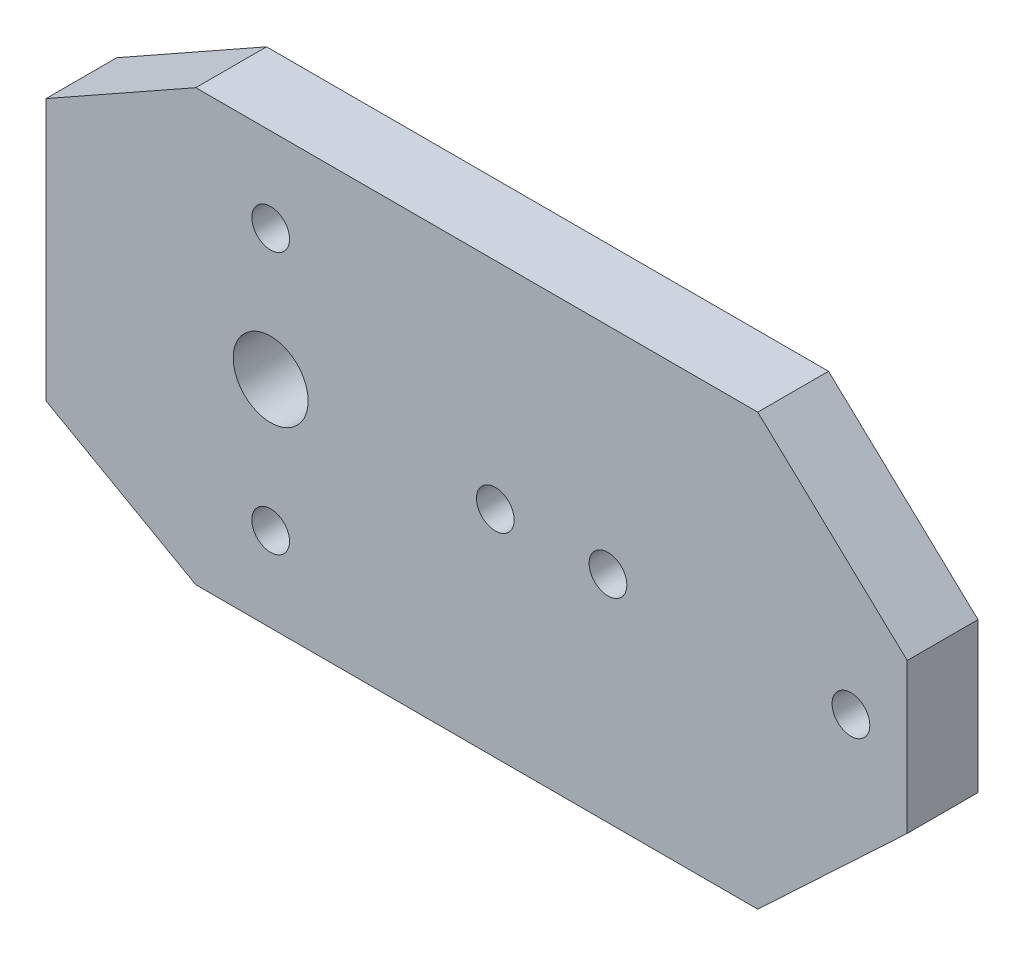
ISO-10303-21;
HEADER;
FILE_DESCRIPTION(('STEP AP214'),'2;1');
FILE_NAME('part.step','',(''),(''),'','','');
FILE_SCHEMA(('AUTOMOTIVE_DESIGN { 1 0 10303 214 1 1 1 1 }'));
ENDSEC;
DATA;
#1=APPLICATION_CONTEXT('core data for automotive mechanical design processes');
#2=APPLICATION_PROTOCOL_DEFINITION('international standard','automotive_design',2000,#1);
#3=PRODUCT_CONTEXT('',#1,'mechanical');
#4=PRODUCT('Part','Part','',(#3));
#5=PRODUCT_RELATED_PRODUCT_CATEGORY('part','',(#4));
#6=PRODUCT_DEFINITION_FORMATION('','',#4);
#7=PRODUCT_DEFINITION_CONTEXT('part definition',#1,'design');
#8=PRODUCT_DEFINITION('design','',#6,#7);
#9=PRODUCT_DEFINITION_SHAPE('','',#8);
#10=(LENGTH_UNIT() NAMED_UNIT(*) SI_UNIT(.MILLI.,.METRE.));
#11=(NAMED_UNIT(*) PLANE_ANGLE_UNIT() SI_UNIT($,.RADIAN.));
#12=(NAMED_UNIT(*) SI_UNIT($,.STERADIAN.) SOLID_ANGLE_UNIT());
#13=UNCERTAINTY_MEASURE_WITH_UNIT(LENGTH_MEASURE(1.E-05),#10,'distance_accuracy_value','');
#14=(GEOMETRIC_REPRESENTATION_CONTEXT(3) GLOBAL_UNCERTAINTY_ASSIGNED_CONTEXT((#13)) GLOBAL_UNIT_ASSIGNED_CONTEXT((#10,
#11,#12)) REPRESENTATION_CONTEXT('',''));
#15=CARTESIAN_POINT('',(0.,0.,0.));
#16=DIRECTION('',(0.,0.,1.));
#17=DIRECTION('',(1.,0.,0.));
#18=AXIS2_PLACEMENT_3D('',#15,#16,#17);
#19=CARTESIAN_POINT('',(0.,0.,6.));
#20=DIRECTION('',(0.,0.,1.));
#21=DIRECTION('',(1.,0.,0.));
#22=AXIS2_PLACEMENT_3D('',#19,#20,#21);
#23=PLANE('',#22);
#24=CARTESIAN_POINT('',(0.,11.1,6.));
#25=DIRECTION('',(0.,0.,1.));
#26=DIRECTION('',(1.,0.,0.));
#27=AXIS2_PLACEMENT_3D('',#24,#25,#26);
#28=CIRCLE('',#27,1.6);
#29=CARTESIAN_POINT('',(1.6,11.1,6.));
#30=VERTEX_POINT('',#29);
#31=EDGE_CURVE('E206',#30,#30,#28,.T.);
#32=ORIENTED_EDGE('',*,*,#31,.F.);
#33=EDGE_LOOP('',(#32));
#34=FACE_BOUND('',#33,.T.);
#35=CARTESIAN_POINT('',(49.2,0.,6.));
#36=DIRECTION('',(0.,0.,1.));
#37=DIRECTION('',(1.,0.,0.));
#38=AXIS2_PLACEMENT_3D('',#35,#36,#37);
#39=CIRCLE('',#38,1.6);
#40=CARTESIAN_POINT('',(50.8,0.,6.));
#41=VERTEX_POINT('',#40);
#42=EDGE_CURVE('E193',#41,#41,#39,.T.);
#43=ORIENTED_EDGE('',*,*,#42,.F.);
#44=EDGE_LOOP('',(#43));
#45=FACE_BOUND('',#44,.T.);
#46=CARTESIAN_POINT('',(19.05,0.,6.));
#47=DIRECTION('',(0.,0.,1.));
#48=DIRECTION('',(1.,0.,0.));
#49=AXIS2_PLACEMENT_3D('',#46,#47,#48);
#50=CIRCLE('',#49,1.6);
#51=CARTESIAN_POINT('',(20.65,0.,6.));
#52=VERTEX_POINT('',#51);
#53=EDGE_CURVE('E139',#52,#52,#50,.T.);
#54=ORIENTED_EDGE('',*,*,#53,.F.);
#55=EDGE_LOOP('',(#54));
#56=FACE_BOUND('',#55,.T.);
#57=DIRECTION('',(0.,-1.,0.));
#58=VECTOR('',#57,1.);
#59=CARTESIAN_POINT('',(-19.05,11.1,6.));
#60=LINE('',#59,#58);
#61=CARTESIAN_POINT('',(-19.05,11.1,6.));
#62=VERTEX_POINT('',#61);
#63=CARTESIAN_POINT('',(-19.05,-11.1,6.));
#64=VERTEX_POINT('',#63);
#65=EDGE_CURVE('E151',#62,#64,#60,.T.);
#66=ORIENTED_EDGE('',*,*,#65,.T.);
#67=DIRECTION('',(0.87139223527957,-0.490586967106215,0.));
#68=VECTOR('',#67,1.);
#69=CARTESIAN_POINT('',(-19.05,-11.1,6.));
#70=LINE('',#69,#68);
#71=CARTESIAN_POINT('',(-6.35,-18.25,6.));
#72=VERTEX_POINT('',#71);
#73=EDGE_CURVE('E97',#64,#72,#70,.T.);
#74=ORIENTED_EDGE('',*,*,#73,.T.);
#75=DIRECTION('',(1.,0.,0.));
#76=VECTOR('',#75,1.);
#77=CARTESIAN_POINT('',(-6.35,-18.25,6.));
#78=LINE('',#77,#76);
#79=CARTESIAN_POINT('',(41.3,-18.25,6.));
#80=VERTEX_POINT('',#79);
#81=EDGE_CURVE('E167',#72,#80,#78,.T.);
#82=ORIENTED_EDGE('',*,*,#81,.T.);
#83=DIRECTION('',(0.729043744639039,0.684467105420478,0.));
#84=VECTOR('',#83,1.);
#85=CARTESIAN_POINT('',(41.3,-18.25,6.));
#86=LINE('',#85,#84);
#87=CARTESIAN_POINT('',(53.975,-6.35,6.));
#88=VERTEX_POINT('',#87);
#89=EDGE_CURVE('E178',#80,#88,#86,.T.);
#90=ORIENTED_EDGE('',*,*,#89,.T.);
#91=DIRECTION('',(0.,1.,0.));
#92=VECTOR('',#91,1.);
#93=CARTESIAN_POINT('',(53.975,-6.35,6.));
#94=LINE('',#93,#92);
#95=CARTESIAN_POINT('',(53.975,6.35,6.));
#96=VERTEX_POINT('',#95);
#97=EDGE_CURVE('E119',#88,#96,#94,.T.);
#98=ORIENTED_EDGE('',*,*,#97,.T.);
#99=DIRECTION('',(-0.729043744639039,0.684467105420478,0.));
#100=VECTOR('',#99,1.);
#101=CARTESIAN_POINT('',(53.975,6.35,6.));
#102=LINE('',#101,#100);
#103=CARTESIAN_POINT('',(41.3,18.25,6.));
#104=VERTEX_POINT('',#103);
#105=EDGE_CURVE('E115',#96,#104,#102,.T.);
#106=ORIENTED_EDGE('',*,*,#105,.T.);
#107=DIRECTION('',(-1.,0.,0.));
#108=VECTOR('',#107,1.);
#109=CARTESIAN_POINT('',(41.3,18.25,6.));
#110=LINE('',#109,#108);
#111=CARTESIAN_POINT('',(-6.35,18.25,6.));
#112=VERTEX_POINT('',#111);
#113=EDGE_CURVE('E117',#104,#112,#110,.T.);
#114=ORIENTED_EDGE('',*,*,#113,.T.);
#115=DIRECTION('',(-0.87139223527957,-0.490586967106215,0.));
#116=VECTOR('',#115,1.);
#117=CARTESIAN_POINT('',(-6.35,18.25,6.));
#118=LINE('',#117,#116);
#119=EDGE_CURVE('E57',#112,#62,#118,.T.);
#120=ORIENTED_EDGE('',*,*,#119,.T.);
#121=EDGE_LOOP('',(#66,#74,#82,#90,#98,#106,#114,#120));
#122=FACE_BOUND('',#121,.T.);
#123=CARTESIAN_POINT('',(28.6,0.,6.));
#124=DIRECTION('',(0.,0.,1.));
#125=DIRECTION('',(1.,0.,0.));
#126=AXIS2_PLACEMENT_3D('',#123,#124,#125);
#127=CIRCLE('',#126,1.6);
#128=CARTESIAN_POINT('',(30.2,0.,6.));
#129=VERTEX_POINT('',#128);
#130=EDGE_CURVE('E189',#129,#129,#127,.T.);
#131=ORIENTED_EDGE('',*,*,#130,.F.);
#132=EDGE_LOOP('',(#131));
#133=FACE_BOUND('',#132,.T.);
#134=CARTESIAN_POINT('',(0.,0.,6.));
#135=DIRECTION('',(0.,0.,1.));
#136=DIRECTION('',(1.,0.,0.));
#137=AXIS2_PLACEMENT_3D('',#134,#135,#136);
#138=CIRCLE('',#137,3.175);
#139=CARTESIAN_POINT('',(3.175,0.,6.));
#140=VERTEX_POINT('',#139);
#141=EDGE_CURVE('E199',#140,#140,#138,.T.);
#142=ORIENTED_EDGE('',*,*,#141,.F.);
#143=EDGE_LOOP('',(#142));
#144=FACE_BOUND('',#143,.T.);
#145=CARTESIAN_POINT('',(0.,-11.1,6.));
#146=DIRECTION('',(0.,0.,1.));
#147=DIRECTION('',(1.,0.,0.));
#148=AXIS2_PLACEMENT_3D('',#145,#146,#147);
#149=CIRCLE('',#148,1.6);
#150=CARTESIAN_POINT('',(1.6,-11.1,6.));
#151=VERTEX_POINT('',#150);
#152=EDGE_CURVE('E215',#151,#151,#149,.T.);
#153=ORIENTED_EDGE('',*,*,#152,.F.);
#154=EDGE_LOOP('',(#153));
#155=FACE_BOUND('',#154,.T.);
#156=ADVANCED_FACE('F39',(#34,#45,#56,#122,#133,#144,#155),#23,.T.);
#157=CARTESIAN_POINT('',(0.,0.,0.));
#158=DIRECTION('',(0.,0.,1.));
#159=DIRECTION('',(1.,0.,0.));
#160=AXIS2_PLACEMENT_3D('',#157,#158,#159);
#161=PLANE('',#160);
#162=DIRECTION('',(0.,-1.,0.));
#163=VECTOR('',#162,1.);
#164=CARTESIAN_POINT('',(-19.05,11.1,0.));
#165=LINE('',#164,#163);
#166=CARTESIAN_POINT('',(-19.05,11.1,0.));
#167=VERTEX_POINT('',#166);
#168=CARTESIAN_POINT('',(-19.05,-11.1,0.));
#169=VERTEX_POINT('',#168);
#170=EDGE_CURVE('E136',#167,#169,#165,.T.);
#171=ORIENTED_EDGE('',*,*,#170,.F.);
#172=DIRECTION('',(-0.87139223527957,-0.490586967106215,0.));
#173=VECTOR('',#172,1.);
#174=CARTESIAN_POINT('',(-6.35,18.25,0.));
#175=LINE('',#174,#173);
#176=CARTESIAN_POINT('',(-6.35,18.25,0.));
#177=VERTEX_POINT('',#176);
#178=EDGE_CURVE('E93',#177,#167,#175,.T.);
#179=ORIENTED_EDGE('',*,*,#178,.F.);
#180=DIRECTION('',(-1.,0.,0.));
#181=VECTOR('',#180,1.);
#182=CARTESIAN_POINT('',(41.3,18.25,0.));
#183=LINE('',#182,#181);
#184=CARTESIAN_POINT('',(41.3,18.25,0.));
#185=VERTEX_POINT('',#184);
#186=EDGE_CURVE('E84',#185,#177,#183,.T.);
#187=ORIENTED_EDGE('',*,*,#186,.F.);
#188=DIRECTION('',(-0.729043744639039,0.684467105420478,0.));
#189=VECTOR('',#188,1.);
#190=CARTESIAN_POINT('',(53.975,6.35,0.));
#191=LINE('',#190,#189);
#192=CARTESIAN_POINT('',(53.975,6.35,0.));
#193=VERTEX_POINT('',#192);
#194=EDGE_CURVE('E127',#193,#185,#191,.T.);
#195=ORIENTED_EDGE('',*,*,#194,.F.);
#196=DIRECTION('',(0.,1.,0.));
#197=VECTOR('',#196,1.);
#198=CARTESIAN_POINT('',(53.975,-6.35,0.));
#199=LINE('',#198,#197);
#200=CARTESIAN_POINT('',(53.975,-6.35,0.));
#201=VERTEX_POINT('',#200);
#202=EDGE_CURVE('E148',#201,#193,#199,.T.);
#203=ORIENTED_EDGE('',*,*,#202,.F.);
#204=DIRECTION('',(0.729043744639039,0.684467105420478,0.));
#205=VECTOR('',#204,1.);
#206=CARTESIAN_POINT('',(41.3,-18.25,0.));
#207=LINE('',#206,#205);
#208=CARTESIAN_POINT('',(41.3,-18.25,0.));
#209=VERTEX_POINT('',#208);
#210=EDGE_CURVE('E145',#209,#201,#207,.T.);
#211=ORIENTED_EDGE('',*,*,#210,.F.);
#212=DIRECTION('',(1.,0.,0.));
#213=VECTOR('',#212,1.);
#214=CARTESIAN_POINT('',(-6.35,-18.25,0.));
#215=LINE('',#214,#213);
#216=CARTESIAN_POINT('',(-6.35,-18.25,0.));
#217=VERTEX_POINT('',#216);
#218=EDGE_CURVE('E142',#217,#209,#215,.T.);
#219=ORIENTED_EDGE('',*,*,#218,.F.);
#220=DIRECTION('',(0.87139223527957,-0.490586967106215,0.));
#221=VECTOR('',#220,1.);
#222=CARTESIAN_POINT('',(-19.05,-11.1,0.));
#223=LINE('',#222,#221);
#224=EDGE_CURVE('E138',#169,#217,#223,.T.);
#225=ORIENTED_EDGE('',*,*,#224,.F.);
#226=EDGE_LOOP('',(#171,#179,#187,#195,#203,#211,#219,#225));
#227=FACE_BOUND('',#226,.T.);
#228=CARTESIAN_POINT('',(19.05,0.,0.));
#229=DIRECTION('',(0.,0.,1.));
#230=DIRECTION('',(1.,0.,0.));
#231=AXIS2_PLACEMENT_3D('',#228,#229,#230);
#232=CIRCLE('',#231,1.6);
#233=CARTESIAN_POINT('',(20.65,0.,0.));
#234=VERTEX_POINT('',#233);
#235=EDGE_CURVE('E183',#234,#234,#232,.T.);
#236=ORIENTED_EDGE('',*,*,#235,.T.);
#237=EDGE_LOOP('',(#236));
#238=FACE_BOUND('',#237,.T.);
#239=CARTESIAN_POINT('',(28.6,0.,0.));
#240=DIRECTION('',(0.,0.,1.));
#241=DIRECTION('',(1.,0.,0.));
#242=AXIS2_PLACEMENT_3D('',#239,#240,#241);
#243=CIRCLE('',#242,1.6);
#244=CARTESIAN_POINT('',(30.2,0.,0.));
#245=VERTEX_POINT('',#244);
#246=EDGE_CURVE('E191',#245,#245,#243,.T.);
#247=ORIENTED_EDGE('',*,*,#246,.T.);
#248=EDGE_LOOP('',(#247));
#249=FACE_BOUND('',#248,.T.);
#250=CARTESIAN_POINT('',(49.2,0.,0.));
#251=DIRECTION('',(0.,0.,1.));
#252=DIRECTION('',(1.,0.,0.));
#253=AXIS2_PLACEMENT_3D('',#250,#251,#252);
#254=CIRCLE('',#253,1.6);
#255=CARTESIAN_POINT('',(50.8,0.,0.));
#256=VERTEX_POINT('',#255);
#257=EDGE_CURVE('E197',#256,#256,#254,.T.);
#258=ORIENTED_EDGE('',*,*,#257,.T.);
#259=EDGE_LOOP('',(#258));
#260=FACE_BOUND('',#259,.T.);
#261=CARTESIAN_POINT('',(0.,0.,0.));
#262=DIRECTION('',(0.,0.,1.));
#263=DIRECTION('',(1.,0.,0.));
#264=AXIS2_PLACEMENT_3D('',#261,#262,#263);
#265=CIRCLE('',#264,3.175);
#266=CARTESIAN_POINT('',(3.175,0.,0.));
#267=VERTEX_POINT('',#266);
#268=EDGE_CURVE('E201',#267,#267,#265,.T.);
#269=ORIENTED_EDGE('',*,*,#268,.T.);
#270=EDGE_LOOP('',(#269));
#271=FACE_BOUND('',#270,.T.);
#272=CARTESIAN_POINT('',(0.,11.1,0.));
#273=DIRECTION('',(0.,0.,1.));
#274=DIRECTION('',(1.,0.,0.));
#275=AXIS2_PLACEMENT_3D('',#272,#273,#274);
#276=CIRCLE('',#275,1.6);
#277=CARTESIAN_POINT('',(1.6,11.1,0.));
#278=VERTEX_POINT('',#277);
#279=EDGE_CURVE('E207',#278,#278,#276,.T.);
#280=ORIENTED_EDGE('',*,*,#279,.T.);
#281=EDGE_LOOP('',(#280));
#282=FACE_BOUND('',#281,.T.);
#283=CARTESIAN_POINT('',(0.,-11.1,0.));
#284=DIRECTION('',(0.,0.,1.));
#285=DIRECTION('',(1.,0.,0.));
#286=AXIS2_PLACEMENT_3D('',#283,#284,#285);
#287=CIRCLE('',#286,1.6);
#288=CARTESIAN_POINT('',(1.6,-11.1,0.));
#289=VERTEX_POINT('',#288);
#290=EDGE_CURVE('E214',#289,#289,#287,.T.);
#291=ORIENTED_EDGE('',*,*,#290,.T.);
#292=EDGE_LOOP('',(#291));
#293=FACE_BOUND('',#292,.T.);
#294=ADVANCED_FACE('F168',(#227,#238,#249,#260,#271,#282,#293),#161,.F.);
#295=CARTESIAN_POINT('',(-19.05,11.1,6.));
#296=DIRECTION('',(1.,0.,0.));
#297=DIRECTION('',(0.,0.,-1.));
#298=AXIS2_PLACEMENT_3D('',#295,#296,#297);
#299=PLANE('',#298);
#300=ORIENTED_EDGE('',*,*,#170,.T.);
#301=DIRECTION('',(0.,0.,-1.));
#302=VECTOR('',#301,1.);
#303=CARTESIAN_POINT('',(-19.05,-11.1,6.));
#304=LINE('',#303,#302);
#305=EDGE_CURVE('E11',#64,#169,#304,.T.);
#306=ORIENTED_EDGE('',*,*,#305,.F.);
#307=ORIENTED_EDGE('',*,*,#65,.F.);
#308=DIRECTION('',(0.,0.,-1.));
#309=VECTOR('',#308,1.);
#310=CARTESIAN_POINT('',(-19.05,11.1,6.));
#311=LINE('',#310,#309);
#312=EDGE_CURVE('E135',#62,#167,#311,.T.);
#313=ORIENTED_EDGE('',*,*,#312,.T.);
#314=EDGE_LOOP('',(#300,#306,#307,#313));
#315=FACE_BOUND('',#314,.T.);
#316=ADVANCED_FACE('F41',(#315),#299,.F.);
#317=CARTESIAN_POINT('',(-19.05,-11.1,6.));
#318=DIRECTION('',(0.490586967106215,0.87139223527957,0.));
#319=DIRECTION('',(-0.87139223527957,0.490586967106215,0.));
#320=AXIS2_PLACEMENT_3D('',#317,#318,#319);
#321=PLANE('',#320);
#322=ORIENTED_EDGE('',*,*,#224,.T.);
#323=DIRECTION('',(0.,0.,-1.));
#324=VECTOR('',#323,1.);
#325=CARTESIAN_POINT('',(-6.35,-18.25,6.));
#326=LINE('',#325,#324);
#327=EDGE_CURVE('E48',#72,#217,#326,.T.);
#328=ORIENTED_EDGE('',*,*,#327,.F.);
#329=ORIENTED_EDGE('',*,*,#73,.F.);
#330=ORIENTED_EDGE('',*,*,#305,.T.);
#331=EDGE_LOOP('',(#322,#328,#329,#330));
#332=FACE_BOUND('',#331,.T.);
#333=ADVANCED_FACE('F248',(#332),#321,.F.);
#334=CARTESIAN_POINT('',(-6.35,-18.25,6.));
#335=DIRECTION('',(0.,1.,0.));
#336=DIRECTION('',(0.,0.,1.));
#337=AXIS2_PLACEMENT_3D('',#334,#335,#336);
#338=PLANE('',#337);
#339=ORIENTED_EDGE('',*,*,#218,.T.);
#340=DIRECTION('',(0.,0.,-1.));
#341=VECTOR('',#340,1.);
#342=CARTESIAN_POINT('',(41.3,-18.25,6.));
#343=LINE('',#342,#341);
#344=EDGE_CURVE('E158',#80,#209,#343,.T.);
#345=ORIENTED_EDGE('',*,*,#344,.F.);
#346=ORIENTED_EDGE('',*,*,#81,.F.);
#347=ORIENTED_EDGE('',*,*,#327,.T.);
#348=EDGE_LOOP('',(#339,#345,#346,#347));
#349=FACE_BOUND('',#348,.T.);
#350=ADVANCED_FACE('F163',(#349),#338,.F.);
#351=CARTESIAN_POINT('',(41.3,-18.25,6.));
#352=DIRECTION('',(-0.684467105420478,0.729043744639039,0.));
#353=DIRECTION('',(-0.729043744639039,-0.684467105420478,0.));
#354=AXIS2_PLACEMENT_3D('',#351,#352,#353);
#355=PLANE('',#354);
#356=ORIENTED_EDGE('',*,*,#210,.T.);
#357=DIRECTION('',(0.,0.,-1.));
#358=VECTOR('',#357,1.);
#359=CARTESIAN_POINT('',(53.975,-6.35,6.));
#360=LINE('',#359,#358);
#361=EDGE_CURVE('E154',#88,#201,#360,.T.);
#362=ORIENTED_EDGE('',*,*,#361,.F.);
#363=ORIENTED_EDGE('',*,*,#89,.F.);
#364=ORIENTED_EDGE('',*,*,#344,.T.);
#365=EDGE_LOOP('',(#356,#362,#363,#364));
#366=FACE_BOUND('',#365,.T.);
#367=ADVANCED_FACE('F173',(#366),#355,.F.);
#368=CARTESIAN_POINT('',(53.975,-6.35,6.));
#369=DIRECTION('',(-1.,0.,0.));
#370=DIRECTION('',(0.,0.,1.));
#371=AXIS2_PLACEMENT_3D('',#368,#369,#370);
#372=PLANE('',#371);
#373=ORIENTED_EDGE('',*,*,#202,.T.);
#374=DIRECTION('',(0.,0.,-1.));
#375=VECTOR('',#374,1.);
#376=CARTESIAN_POINT('',(53.975,6.35,6.));
#377=LINE('',#376,#375);
#378=EDGE_CURVE('E130',#96,#193,#377,.T.);
#379=ORIENTED_EDGE('',*,*,#378,.F.);
#380=ORIENTED_EDGE('',*,*,#97,.F.);
#381=ORIENTED_EDGE('',*,*,#361,.T.);
#382=EDGE_LOOP('',(#373,#379,#380,#381));
#383=FACE_BOUND('',#382,.T.);
#384=ADVANCED_FACE('F177',(#383),#372,.F.);
#385=CARTESIAN_POINT('',(53.975,6.35,6.));
#386=DIRECTION('',(-0.684467105420478,-0.729043744639039,0.));
#387=DIRECTION('',(0.729043744639039,-0.684467105420478,0.));
#388=AXIS2_PLACEMENT_3D('',#385,#386,#387);
#389=PLANE('',#388);
#390=ORIENTED_EDGE('',*,*,#194,.T.);
#391=DIRECTION('',(0.,0.,-1.));
#392=VECTOR('',#391,1.);
#393=CARTESIAN_POINT('',(41.3,18.25,6.));
#394=LINE('',#393,#392);
#395=EDGE_CURVE('E122',#104,#185,#394,.T.);
#396=ORIENTED_EDGE('',*,*,#395,.F.);
#397=ORIENTED_EDGE('',*,*,#105,.F.);
#398=ORIENTED_EDGE('',*,*,#378,.T.);
#399=EDGE_LOOP('',(#390,#396,#397,#398));
#400=FACE_BOUND('',#399,.T.);
#401=ADVANCED_FACE('F123',(#400),#389,.F.);
#402=CARTESIAN_POINT('',(41.3,18.25,6.));
#403=DIRECTION('',(0.,-1.,0.));
#404=DIRECTION('',(0.,0.,-1.));
#405=AXIS2_PLACEMENT_3D('',#402,#403,#404);
#406=PLANE('',#405);
#407=ORIENTED_EDGE('',*,*,#186,.T.);
#408=DIRECTION('',(0.,0.,-1.));
#409=VECTOR('',#408,1.);
#410=CARTESIAN_POINT('',(-6.35,18.25,6.));
#411=LINE('',#410,#409);
#412=EDGE_CURVE('E126',#112,#177,#411,.T.);
#413=ORIENTED_EDGE('',*,*,#412,.F.);
#414=ORIENTED_EDGE('',*,*,#113,.F.);
#415=ORIENTED_EDGE('',*,*,#395,.T.);
#416=EDGE_LOOP('',(#407,#413,#414,#415));
#417=FACE_BOUND('',#416,.T.);
#418=ADVANCED_FACE('F128',(#417),#406,.F.);
#419=CARTESIAN_POINT('',(-6.35,18.25,6.));
#420=DIRECTION('',(0.490586967106215,-0.87139223527957,0.));
#421=DIRECTION('',(0.87139223527957,0.490586967106215,0.));
#422=AXIS2_PLACEMENT_3D('',#419,#420,#421);
#423=PLANE('',#422);
#424=ORIENTED_EDGE('',*,*,#178,.T.);
#425=ORIENTED_EDGE('',*,*,#312,.F.);
#426=ORIENTED_EDGE('',*,*,#119,.F.);
#427=ORIENTED_EDGE('',*,*,#412,.T.);
#428=EDGE_LOOP('',(#424,#425,#426,#427));
#429=FACE_BOUND('',#428,.T.);
#430=ADVANCED_FACE('F240',(#429),#423,.F.);
#431=CARTESIAN_POINT('',(19.05,0.,6.));
#432=DIRECTION('',(0.,0.,-1.));
#433=DIRECTION('',(-1.,0.,0.));
#434=AXIS2_PLACEMENT_3D('',#431,#432,#433);
#435=CYLINDRICAL_SURFACE('',#434,1.6);
#436=ORIENTED_EDGE('',*,*,#53,.T.);
#437=EDGE_LOOP('',(#436));
#438=FACE_BOUND('',#437,.T.);
#439=ORIENTED_EDGE('',*,*,#235,.F.);
#440=EDGE_LOOP('',(#439));
#441=FACE_BOUND('',#440,.T.);
#442=ADVANCED_FACE('F233',(#438,#441),#435,.F.);
#443=CARTESIAN_POINT('',(28.6,0.,6.));
#444=DIRECTION('',(0.,0.,-1.));
#445=DIRECTION('',(-1.,0.,0.));
#446=AXIS2_PLACEMENT_3D('',#443,#444,#445);
#447=CYLINDRICAL_SURFACE('',#446,1.6);
#448=ORIENTED_EDGE('',*,*,#130,.T.);
#449=EDGE_LOOP('',(#448));
#450=FACE_BOUND('',#449,.T.);
#451=ORIENTED_EDGE('',*,*,#246,.F.);
#452=EDGE_LOOP('',(#451));
#453=FACE_BOUND('',#452,.T.);
#454=ADVANCED_FACE('F315',(#450,#453),#447,.F.);
#455=CARTESIAN_POINT('',(49.2,0.,6.));
#456=DIRECTION('',(0.,0.,-1.));
#457=DIRECTION('',(-1.,0.,0.));
#458=AXIS2_PLACEMENT_3D('',#455,#456,#457);
#459=CYLINDRICAL_SURFACE('',#458,1.6);
#460=ORIENTED_EDGE('',*,*,#42,.T.);
#461=EDGE_LOOP('',(#460));
#462=FACE_BOUND('',#461,.T.);
#463=ORIENTED_EDGE('',*,*,#257,.F.);
#464=EDGE_LOOP('',(#463));
#465=FACE_BOUND('',#464,.T.);
#466=ADVANCED_FACE('F319',(#462,#465),#459,.F.);
#467=CARTESIAN_POINT('',(0.,0.,6.));
#468=DIRECTION('',(0.,0.,-1.));
#469=DIRECTION('',(-1.,0.,0.));
#470=AXIS2_PLACEMENT_3D('',#467,#468,#469);
#471=CYLINDRICAL_SURFACE('',#470,3.175);
#472=ORIENTED_EDGE('',*,*,#141,.T.);
#473=EDGE_LOOP('',(#472));
#474=FACE_BOUND('',#473,.T.);
#475=ORIENTED_EDGE('',*,*,#268,.F.);
#476=EDGE_LOOP('',(#475));
#477=FACE_BOUND('',#476,.T.);
#478=ADVANCED_FACE('F327',(#474,#477),#471,.F.);
#479=CARTESIAN_POINT('',(0.,11.1,6.));
#480=DIRECTION('',(0.,0.,-1.));
#481=DIRECTION('',(-1.,0.,0.));
#482=AXIS2_PLACEMENT_3D('',#479,#480,#481);
#483=CYLINDRICAL_SURFACE('',#482,1.6);
#484=ORIENTED_EDGE('',*,*,#31,.T.);
#485=EDGE_LOOP('',(#484));
#486=FACE_BOUND('',#485,.T.);
#487=ORIENTED_EDGE('',*,*,#279,.F.);
#488=EDGE_LOOP('',(#487));
#489=FACE_BOUND('',#488,.T.);
#490=ADVANCED_FACE('F340',(#486,#489),#483,.F.);
#491=CARTESIAN_POINT('',(0.,-11.1,6.));
#492=DIRECTION('',(0.,0.,-1.));
#493=DIRECTION('',(-1.,0.,0.));
#494=AXIS2_PLACEMENT_3D('',#491,#492,#493);
#495=CYLINDRICAL_SURFACE('',#494,1.6);
#496=ORIENTED_EDGE('',*,*,#152,.T.);
#497=EDGE_LOOP('',(#496));
#498=FACE_BOUND('',#497,.T.);
#499=ORIENTED_EDGE('',*,*,#290,.F.);
#500=EDGE_LOOP('',(#499));
#501=FACE_BOUND('',#500,.T.);
#502=ADVANCED_FACE('F222',(#498,#501),#495,.F.);
#503=CLOSED_SHELL('',(#156,#294,#316,#333,#350,#367,#384,#401,#418,#430,#442,#454,#466,#478,
#490,#502));
#504=MANIFOLD_SOLID_BREP('B2',#503);
#505=ADVANCED_BREP_SHAPE_REPRESENTATION('',(#18,#504),#14);
#506=SHAPE_DEFINITION_REPRESENTATION(#9,#505);
ENDSEC;
END-ISO-10303-21;
